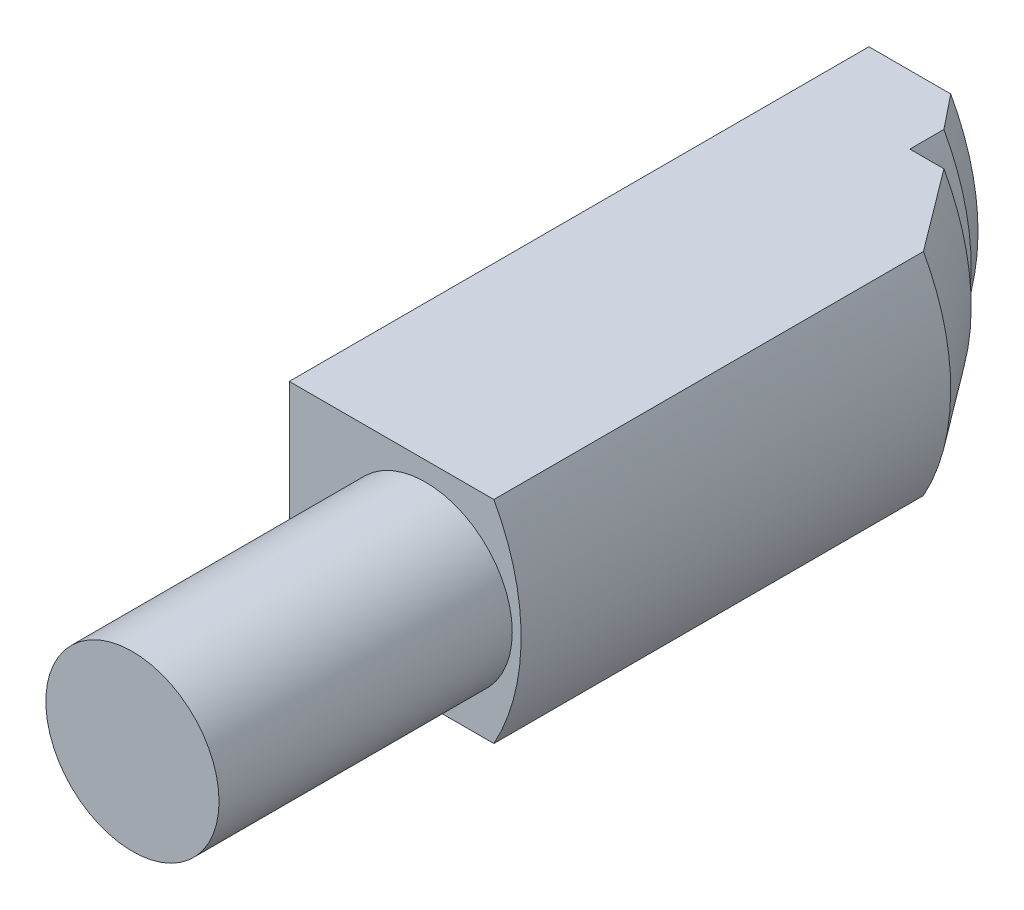
ISO-10303-21;
HEADER;
FILE_DESCRIPTION(('STEP AP214'),'2;1');
FILE_NAME('part.step','',(''),(''),'','','');
FILE_SCHEMA(('AUTOMOTIVE_DESIGN { 1 0 10303 214 1 1 1 1 }'));
ENDSEC;
DATA;
#1=APPLICATION_CONTEXT('core data for automotive mechanical design processes');
#2=APPLICATION_PROTOCOL_DEFINITION('international standard','automotive_design',2000,#1);
#3=PRODUCT_CONTEXT('',#1,'mechanical');
#4=PRODUCT('Part','Part','',(#3));
#5=PRODUCT_RELATED_PRODUCT_CATEGORY('part','',(#4));
#6=PRODUCT_DEFINITION_FORMATION('','',#4);
#7=PRODUCT_DEFINITION_CONTEXT('part definition',#1,'design');
#8=PRODUCT_DEFINITION('design','',#6,#7);
#9=PRODUCT_DEFINITION_SHAPE('','',#8);
#10=(LENGTH_UNIT() NAMED_UNIT(*) SI_UNIT(.MILLI.,.METRE.));
#11=(NAMED_UNIT(*) PLANE_ANGLE_UNIT() SI_UNIT($,.RADIAN.));
#12=(NAMED_UNIT(*) SI_UNIT($,.STERADIAN.) SOLID_ANGLE_UNIT());
#13=UNCERTAINTY_MEASURE_WITH_UNIT(LENGTH_MEASURE(1.E-05),#10,'distance_accuracy_value','');
#14=(GEOMETRIC_REPRESENTATION_CONTEXT(3) GLOBAL_UNCERTAINTY_ASSIGNED_CONTEXT((#13)) GLOBAL_UNIT_ASSIGNED_CONTEXT((#10,
#11,#12)) REPRESENTATION_CONTEXT('',''));
#15=CARTESIAN_POINT('',(0.,0.,0.));
#16=DIRECTION('',(0.,0.,1.));
#17=DIRECTION('',(1.,0.,0.));
#18=AXIS2_PLACEMENT_3D('',#15,#16,#17);
#19=CARTESIAN_POINT('',(-75.,-77.5,425.));
#20=DIRECTION('',(0.,1.,0.));
#21=DIRECTION('',(0.,0.,1.));
#22=AXIS2_PLACEMENT_3D('',#19,#20,#21);
#23=PLANE('',#22);
#24=DIRECTION('',(-0.62469504755442,0.,-0.780868809443034));
#25=VECTOR('',#24,1.);
#26=CARTESIAN_POINT('',(4.99999999999996,-77.5,24.9999999999999));
#27=LINE('',#26,#25);
#28=CARTESIAN_POINT('',(4.99999999999996,-77.5,24.9999999999999));
#29=VERTEX_POINT('',#28);
#30=CARTESIAN_POINT('',(-15.,-77.5,-3.20056481317721E-13));
#31=VERTEX_POINT('',#30);
#32=EDGE_CURVE('E206',#29,#31,#27,.T.);
#33=ORIENTED_EDGE('',*,*,#32,.F.);
#34=DIRECTION('',(0.,0.,-1.));
#35=VECTOR('',#34,1.);
#36=CARTESIAN_POINT('',(4.9999999999999,-77.5,49.9999999999999));
#37=LINE('',#36,#35);
#38=CARTESIAN_POINT('',(4.9999999999999,-77.5,49.9999999999999));
#39=VERTEX_POINT('',#38);
#40=EDGE_CURVE('E122',#39,#29,#37,.T.);
#41=ORIENTED_EDGE('',*,*,#40,.F.);
#42=DIRECTION('',(-1.,0.,0.));
#43=VECTOR('',#42,1.);
#44=CARTESIAN_POINT('',(4.9999999999999,-77.5,49.9999999999999));
#45=LINE('',#44,#43);
#46=CARTESIAN_POINT('',(29.9999999999999,-77.5,49.9999999999999));
#47=VERTEX_POINT('',#46);
#48=EDGE_CURVE('E207',#47,#39,#45,.T.);
#49=ORIENTED_EDGE('',*,*,#48,.F.);
#50=DIRECTION('',(-0.599999999999999,0.,-0.800000000000001));
#51=VECTOR('',#50,1.);
#52=CARTESIAN_POINT('',(29.9999999999999,-77.5,49.9999999999999));
#53=LINE('',#52,#51);
#54=CARTESIAN_POINT('',(74.9999999999998,-77.5,110.));
#55=VERTEX_POINT('',#54);
#56=EDGE_CURVE('E195',#55,#47,#53,.T.);
#57=ORIENTED_EDGE('',*,*,#56,.F.);
#58=DIRECTION('',(0.,0.,-1.));
#59=VECTOR('',#58,1.);
#60=CARTESIAN_POINT('',(75.0000000000001,-77.5,425.));
#61=LINE('',#60,#59);
#62=CARTESIAN_POINT('',(75.0000000000001,-77.5,425.));
#63=VERTEX_POINT('',#62);
#64=EDGE_CURVE('E308',#63,#55,#61,.T.);
#65=ORIENTED_EDGE('',*,*,#64,.F.);
#66=DIRECTION('',(1.,0.,0.));
#67=VECTOR('',#66,1.);
#68=CARTESIAN_POINT('',(-75.,-77.5,425.));
#69=LINE('',#68,#67);
#70=CARTESIAN_POINT('',(-75.,-77.5,425.));
#71=VERTEX_POINT('',#70);
#72=EDGE_CURVE('E169',#71,#63,#69,.T.);
#73=ORIENTED_EDGE('',*,*,#72,.F.);
#74=DIRECTION('',(0.,0.,-1.));
#75=VECTOR('',#74,1.);
#76=CARTESIAN_POINT('',(-75.,-77.5,425.));
#77=LINE('',#76,#75);
#78=CARTESIAN_POINT('',(-75.,-77.5,0.));
#79=VERTEX_POINT('',#78);
#80=EDGE_CURVE('E128',#71,#79,#77,.T.);
#81=ORIENTED_EDGE('',*,*,#80,.T.);
#82=DIRECTION('',(1.,0.,0.));
#83=VECTOR('',#82,1.);
#84=CARTESIAN_POINT('',(-75.,-77.5,0.));
#85=LINE('',#84,#83);
#86=EDGE_CURVE('E299',#79,#31,#85,.T.);
#87=ORIENTED_EDGE('',*,*,#86,.T.);
#88=EDGE_LOOP('',(#33,#41,#49,#57,#65,#73,#81,#87));
#89=FACE_BOUND('',#88,.T.);
#90=ADVANCED_FACE('F118',(#89),#23,.F.);
#91=CARTESIAN_POINT('',(-75.,77.5,425.));
#92=DIRECTION('',(0.,-1.,0.));
#93=DIRECTION('',(0.,0.,-1.));
#94=AXIS2_PLACEMENT_3D('',#91,#92,#93);
#95=PLANE('',#94);
#96=DIRECTION('',(-0.599999999999996,0.,-0.800000000000003));
#97=VECTOR('',#96,1.);
#98=CARTESIAN_POINT('',(29.9999999999998,77.5,49.9999999999998));
#99=LINE('',#98,#97);
#100=CARTESIAN_POINT('',(75.,77.5,110.));
#101=VERTEX_POINT('',#100);
#102=CARTESIAN_POINT('',(29.9999999999998,77.5,49.9999999999998));
#103=VERTEX_POINT('',#102);
#104=EDGE_CURVE('E136',#101,#103,#99,.T.);
#105=ORIENTED_EDGE('',*,*,#104,.T.);
#106=DIRECTION('',(-1.,0.,0.));
#107=VECTOR('',#106,1.);
#108=CARTESIAN_POINT('',(4.99999999999975,77.5,49.9999999999997));
#109=LINE('',#108,#107);
#110=CARTESIAN_POINT('',(4.99999999999975,77.5,49.9999999999997));
#111=VERTEX_POINT('',#110);
#112=EDGE_CURVE('E217',#103,#111,#109,.T.);
#113=ORIENTED_EDGE('',*,*,#112,.T.);
#114=DIRECTION('',(0.,0.,-1.));
#115=VECTOR('',#114,1.);
#116=CARTESIAN_POINT('',(4.99999999999975,77.5,49.9999999999997));
#117=LINE('',#116,#115);
#118=CARTESIAN_POINT('',(4.99999999999987,77.5,24.9999999999997));
#119=VERTEX_POINT('',#118);
#120=EDGE_CURVE('E229',#111,#119,#117,.T.);
#121=ORIENTED_EDGE('',*,*,#120,.T.);
#122=DIRECTION('',(-0.624695047554418,0.,-0.780868809443035));
#123=VECTOR('',#122,1.);
#124=CARTESIAN_POINT('',(4.99999999999987,77.5,24.9999999999997));
#125=LINE('',#124,#123);
#126=CARTESIAN_POINT('',(-15.,77.5,-5.62050406216485E-13));
#127=VERTEX_POINT('',#126);
#128=EDGE_CURVE('E241',#119,#127,#125,.T.);
#129=ORIENTED_EDGE('',*,*,#128,.T.);
#130=DIRECTION('',(-1.,0.,0.));
#131=VECTOR('',#130,1.);
#132=CARTESIAN_POINT('',(-75.,77.5,0.));
#133=LINE('',#132,#131);
#134=CARTESIAN_POINT('',(-75.,77.5,0.));
#135=VERTEX_POINT('',#134);
#136=EDGE_CURVE('E161',#127,#135,#133,.T.);
#137=ORIENTED_EDGE('',*,*,#136,.T.);
#138=DIRECTION('',(0.,0.,-1.));
#139=VECTOR('',#138,1.);
#140=CARTESIAN_POINT('',(-75.,77.5,425.));
#141=LINE('',#140,#139);
#142=CARTESIAN_POINT('',(-75.,77.5,425.));
#143=VERTEX_POINT('',#142);
#144=EDGE_CURVE('E309',#143,#135,#141,.T.);
#145=ORIENTED_EDGE('',*,*,#144,.F.);
#146=DIRECTION('',(-1.,0.,0.));
#147=VECTOR('',#146,1.);
#148=CARTESIAN_POINT('',(-75.,77.5,425.));
#149=LINE('',#148,#147);
#150=CARTESIAN_POINT('',(75.,77.5,425.));
#151=VERTEX_POINT('',#150);
#152=EDGE_CURVE('E146',#151,#143,#149,.T.);
#153=ORIENTED_EDGE('',*,*,#152,.F.);
#154=DIRECTION('',(0.,0.,-1.));
#155=VECTOR('',#154,1.);
#156=CARTESIAN_POINT('',(75.,77.5,425.));
#157=LINE('',#156,#155);
#158=EDGE_CURVE('E252',#151,#101,#157,.T.);
#159=ORIENTED_EDGE('',*,*,#158,.T.);
#160=EDGE_LOOP('',(#105,#113,#121,#129,#137,#145,#153,#159));
#161=FACE_BOUND('',#160,.T.);
#162=ADVANCED_FACE('F249',(#161),#95,.F.);
#163=CARTESIAN_POINT('',(-75.,77.5,425.));
#164=DIRECTION('',(1.,0.,0.));
#165=DIRECTION('',(0.,1.,0.));
#166=AXIS2_PLACEMENT_3D('',#163,#164,#165);
#167=PLANE('',#166);
#168=DIRECTION('',(0.,-1.,0.));
#169=VECTOR('',#168,1.);
#170=CARTESIAN_POINT('',(-75.,77.5,0.));
#171=LINE('',#170,#169);
#172=EDGE_CURVE('E297',#135,#79,#171,.T.);
#173=ORIENTED_EDGE('',*,*,#172,.T.);
#174=ORIENTED_EDGE('',*,*,#80,.F.);
#175=DIRECTION('',(0.,-1.,0.));
#176=VECTOR('',#175,1.);
#177=CARTESIAN_POINT('',(-75.,77.5,425.));
#178=LINE('',#177,#176);
#179=EDGE_CURVE('E298',#143,#71,#178,.T.);
#180=ORIENTED_EDGE('',*,*,#179,.F.);
#181=ORIENTED_EDGE('',*,*,#144,.T.);
#182=EDGE_LOOP('',(#173,#174,#180,#181));
#183=FACE_BOUND('',#182,.T.);
#184=ADVANCED_FACE('F120',(#183),#167,.F.);
#185=CARTESIAN_POINT('',(-65.15625,0.,425.));
#186=DIRECTION('',(0.,0.,-1.));
#187=DIRECTION('',(-1.,0.,0.));
#188=AXIS2_PLACEMENT_3D('',#185,#186,#187);
#189=CYLINDRICAL_SURFACE('',#188,160.15625);
#190=ORIENTED_EDGE('',*,*,#64,.T.);
#191=CARTESIAN_POINT('',(74.9999999999998,-77.5,110.));
#192=CARTESIAN_POINT('',(101.663535191219,-29.2798567207182,110.));
#193=CARTESIAN_POINT('',(101.663535191219,29.2798567207181,110.));
#194=CARTESIAN_POINT('',(74.9999999999995,77.5,110.));
#195=B_SPLINE_CURVE_WITH_KNOTS('',3,(#191,#192,#193,#194),.UNSPECIFIED.,.F.,.F.,(4,4),(0.,1.),.UNSPECIFIED.);
#196=EDGE_CURVE('E201',#55,#101,#195,.T.);
#197=ORIENTED_EDGE('',*,*,#196,.T.);
#198=ORIENTED_EDGE('',*,*,#158,.F.);
#199=CARTESIAN_POINT('',(-65.15625,0.,425.));
#200=DIRECTION('',(0.,0.,1.));
#201=DIRECTION('',(-1.,0.,0.));
#202=AXIS2_PLACEMENT_3D('',#199,#200,#201);
#203=CIRCLE('',#202,160.15625);
#204=EDGE_CURVE('E319',#63,#151,#203,.T.);
#205=ORIENTED_EDGE('',*,*,#204,.F.);
#206=EDGE_LOOP('',(#190,#197,#198,#205));
#207=FACE_BOUND('',#206,.T.);
#208=ADVANCED_FACE('F273',(#207),#189,.T.);
#209=CARTESIAN_POINT('',(-65.15625,0.,425.));
#210=DIRECTION('',(0.,0.,-1.));
#211=DIRECTION('',(-1.,0.,0.));
#212=AXIS2_PLACEMENT_3D('',#209,#210,#211);
#213=PLANE('',#212);
#214=CARTESIAN_POINT('',(25.,0.,425.));
#215=DIRECTION('',(0.,0.,1.));
#216=DIRECTION('',(1.,0.,0.));
#217=AXIS2_PLACEMENT_3D('',#214,#215,#216);
#218=CIRCLE('',#217,63.5);
#219=CARTESIAN_POINT('',(88.5,0.,425.));
#220=VERTEX_POINT('',#219);
#221=EDGE_CURVE('E13',#220,#220,#218,.T.);
#222=ORIENTED_EDGE('',*,*,#221,.F.);
#223=EDGE_LOOP('',(#222));
#224=FACE_BOUND('',#223,.T.);
#225=ORIENTED_EDGE('',*,*,#179,.T.);
#226=ORIENTED_EDGE('',*,*,#72,.T.);
#227=ORIENTED_EDGE('',*,*,#204,.T.);
#228=ORIENTED_EDGE('',*,*,#152,.T.);
#229=EDGE_LOOP('',(#225,#226,#227,#228));
#230=FACE_BOUND('',#229,.T.);
#231=ADVANCED_FACE('F477',(#224,#230),#213,.F.);
#232=CARTESIAN_POINT('',(-65.15625,0.,0.));
#233=DIRECTION('',(0.,0.,-1.));
#234=DIRECTION('',(-1.,0.,0.));
#235=AXIS2_PLACEMENT_3D('',#232,#233,#234);
#236=PLANE('',#235);
#237=CARTESIAN_POINT('',(-15.,-77.5,-3.12250225675825E-13));
#238=CARTESIAN_POINT('',(11.6635351912193,-29.2798567207182,-3.94938711364053E-13));
#239=CARTESIAN_POINT('',(11.6635351912193,29.2798567207181,-4.78494558790269E-13));
#240=CARTESIAN_POINT('',(-15.,77.5,-5.62050406216485E-13));
#241=B_SPLINE_CURVE_WITH_KNOTS('',3,(#237,#238,#239,#240),.UNSPECIFIED.,.F.,.F.,(4,4),(0.,1.),.UNSPECIFIED.);
#242=EDGE_CURVE('E294',#31,#127,#241,.T.);
#243=ORIENTED_EDGE('',*,*,#242,.F.);
#244=ORIENTED_EDGE('',*,*,#86,.F.);
#245=ORIENTED_EDGE('',*,*,#172,.F.);
#246=ORIENTED_EDGE('',*,*,#136,.F.);
#247=EDGE_LOOP('',(#243,#244,#245,#246));
#248=FACE_BOUND('',#247,.T.);
#249=ADVANCED_FACE('F271',(#248),#236,.T.);
#250=CARTESIAN_POINT('',(29.9999999999999,-77.5,49.9999999999999));
#251=CARTESIAN_POINT('',(56.6635351912192,-29.2798567207182,49.9999999999999));
#252=CARTESIAN_POINT('',(56.6635351912191,29.2798567207181,49.9999999999999));
#253=CARTESIAN_POINT('',(29.9999999999998,77.5,49.9999999999998));
#254=CARTESIAN_POINT('',(33.7499999999999,-77.5,54.9999999999999));
#255=CARTESIAN_POINT('',(60.4135351912191,-29.2798567207182,54.9999999999999));
#256=CARTESIAN_POINT('',(60.4135351912191,29.2798567207181,54.9999999999999));
#257=CARTESIAN_POINT('',(33.7499999999997,77.5,54.9999999999998));
#258=CARTESIAN_POINT('',(41.2499999999999,-77.5000000000001,65.));
#259=CARTESIAN_POINT('',(67.9135351912192,-29.2798567207183,64.9999999999999));
#260=CARTESIAN_POINT('',(67.9135351912192,29.2798567207182,64.9999999999999));
#261=CARTESIAN_POINT('',(41.2499999999998,77.5000000000001,64.9999999999999));
#262=CARTESIAN_POINT('',(52.4999999999998,-77.4999999999999,79.9999999999999));
#263=CARTESIAN_POINT('',(79.163535191219,-29.2798567207182,79.9999999999999));
#264=CARTESIAN_POINT('',(79.163535191219,29.2798567207181,79.9999999999999));
#265=CARTESIAN_POINT('',(52.4999999999995,77.4999999999999,79.9999999999999));
#266=CARTESIAN_POINT('',(63.7499999999999,-77.5000000000001,94.9999999999999));
#267=CARTESIAN_POINT('',(90.4135351912191,-29.2798567207183,94.9999999999999));
#268=CARTESIAN_POINT('',(90.4135351912191,29.2798567207181,94.9999999999999));
#269=CARTESIAN_POINT('',(63.7499999999997,77.5,94.9999999999999));
#270=CARTESIAN_POINT('',(71.2499999999998,-77.5,105.));
#271=CARTESIAN_POINT('',(97.913535191219,-29.2798567207182,105.));
#272=CARTESIAN_POINT('',(97.9135351912189,29.2798567207181,105.));
#273=CARTESIAN_POINT('',(71.2499999999995,77.5,105.));
#274=CARTESIAN_POINT('',(74.9999999999998,-77.5,110.));
#275=CARTESIAN_POINT('',(101.663535191219,-29.2798567207182,110.));
#276=CARTESIAN_POINT('',(101.663535191219,29.2798567207181,110.));
#277=CARTESIAN_POINT('',(74.9999999999995,77.5,110.));
#278=B_SPLINE_SURFACE_WITH_KNOTS('',3,3,((#250,#251,#252,#253),(#254,#255,#256,#257),(#258,#259,
#260,#261),(#262,#263,#264,#265),(#266,#267,#268,#269),(#270,#271,#272,#273),(#274,#275,#276,
#277)),.UNSPECIFIED.,.F.,.F.,.F.,(4,1,1,1,4),(4,4),(0.481815391201008,0.534334101552257,
0.586852811903506,0.639371522254755,0.691890232606005),(0.,1.),.UNSPECIFIED.);
#279=CARTESIAN_POINT('',(29.9999999999999,-77.5,49.9999999999999));
#280=CARTESIAN_POINT('',(56.6635351912192,-29.2798567207182,49.9999999999999));
#281=CARTESIAN_POINT('',(56.6635351912191,29.2798567207181,49.9999999999999));
#282=CARTESIAN_POINT('',(29.9999999999998,77.5,49.9999999999998));
#283=B_SPLINE_CURVE_WITH_KNOTS('',3,(#279,#280,#281,#282),.UNSPECIFIED.,.F.,.F.,(4,4),(0.,1.),.UNSPECIFIED.);
#284=EDGE_CURVE('E199',#47,#103,#283,.T.);
#285=ORIENTED_EDGE('',*,*,#56,.T.);
#286=ORIENTED_EDGE('',*,*,#284,.T.);
#287=ORIENTED_EDGE('',*,*,#104,.F.);
#288=ORIENTED_EDGE('',*,*,#196,.F.);
#289=EDGE_LOOP('',(#285,#286,#287,#288));
#290=FACE_BOUND('',#289,.T.);
#291=ADVANCED_FACE('F198',(#290),#278,.F.);
#292=CARTESIAN_POINT('',(4.9999999999999,-77.5,49.9999999999999));
#293=DIRECTION('',(0.,0.,1.));
#294=DIRECTION('',(1.,0.,0.));
#295=AXIS2_PLACEMENT_3D('',#292,#293,#294);
#296=PLANE('',#295);
#297=ORIENTED_EDGE('',*,*,#48,.T.);
#298=CARTESIAN_POINT('',(4.9999999999999,-77.5,49.9999999999999));
#299=CARTESIAN_POINT('',(31.6635351912191,-29.2798567207182,49.9999999999998));
#300=CARTESIAN_POINT('',(31.6635351912191,29.2798567207181,49.9999999999997));
#301=CARTESIAN_POINT('',(4.99999999999975,77.5,49.9999999999997));
#302=B_SPLINE_CURVE_WITH_KNOTS('',3,(#298,#299,#300,#301),.UNSPECIFIED.,.F.,.F.,(4,4),(0.,1.),.UNSPECIFIED.);
#303=EDGE_CURVE('E218',#39,#111,#302,.T.);
#304=ORIENTED_EDGE('',*,*,#303,.T.);
#305=ORIENTED_EDGE('',*,*,#112,.F.);
#306=ORIENTED_EDGE('',*,*,#284,.F.);
#307=EDGE_LOOP('',(#297,#304,#305,#306));
#308=FACE_BOUND('',#307,.T.);
#309=ADVANCED_FACE('F213',(#308),#296,.F.);
#310=CARTESIAN_POINT('',(4.99999999999996,-77.5,24.9999999999999));
#311=CARTESIAN_POINT('',(31.6635351912192,-29.2798567207182,24.9999999999998));
#312=CARTESIAN_POINT('',(31.6635351912192,29.2798567207181,24.9999999999997));
#313=CARTESIAN_POINT('',(4.99999999999987,77.5,24.9999999999997));
#314=CARTESIAN_POINT('',(4.99999999999995,-77.5,27.0833333333332));
#315=CARTESIAN_POINT('',(31.6635351912192,-29.2798567207182,27.0833333333331));
#316=CARTESIAN_POINT('',(31.6635351912192,29.2798567207181,27.0833333333331));
#317=CARTESIAN_POINT('',(4.99999999999986,77.5,27.083333333333));
#318=CARTESIAN_POINT('',(4.99999999999995,-77.5000000000001,31.2499999999999));
#319=CARTESIAN_POINT('',(31.6635351912192,-29.2798567207182,31.2499999999998));
#320=CARTESIAN_POINT('',(31.6635351912192,29.2798567207182,31.2499999999998));
#321=CARTESIAN_POINT('',(4.99999999999985,77.5000000000001,31.2499999999997));
#322=CARTESIAN_POINT('',(4.99999999999993,-77.4999999999999,37.4999999999999));
#323=CARTESIAN_POINT('',(31.6635351912192,-29.2798567207182,37.4999999999998));
#324=CARTESIAN_POINT('',(31.6635351912192,29.2798567207181,37.4999999999997));
#325=CARTESIAN_POINT('',(4.9999999999998,77.4999999999999,37.4999999999996));
#326=CARTESIAN_POINT('',(4.99999999999991,-77.5000000000001,43.7499999999999));
#327=CARTESIAN_POINT('',(31.6635351912192,-29.2798567207183,43.7499999999998));
#328=CARTESIAN_POINT('',(31.6635351912192,29.2798567207182,43.7499999999998));
#329=CARTESIAN_POINT('',(4.99999999999979,77.5000000000001,43.7499999999997));
#330=CARTESIAN_POINT('',(4.99999999999991,-77.5,47.9166666666665));
#331=CARTESIAN_POINT('',(31.6635351912192,-29.2798567207182,47.9166666666665));
#332=CARTESIAN_POINT('',(31.6635351912191,29.2798567207181,47.9166666666664));
#333=CARTESIAN_POINT('',(4.99999999999976,77.5,47.9166666666663));
#334=CARTESIAN_POINT('',(4.9999999999999,-77.5,49.9999999999999));
#335=CARTESIAN_POINT('',(31.6635351912191,-29.2798567207182,49.9999999999998));
#336=CARTESIAN_POINT('',(31.6635351912191,29.2798567207181,49.9999999999997));
#337=CARTESIAN_POINT('',(4.99999999999975,77.5,49.9999999999997));
#338=B_SPLINE_SURFACE_WITH_KNOTS('',3,3,((#310,#311,#312,#313),(#314,#315,#316,#317),(#318,#319,
#320,#321),(#322,#323,#324,#325),(#326,#327,#328,#329),(#330,#331,#332,#333),(#334,#335,#336,
#337)),.UNSPECIFIED.,.F.,.F.,.F.,(4,1,1,1,4),(4,4),(0.34176549693101,0.35927173371476,
0.376777970498509,0.394284207282259,0.411790444066009),(0.,1.),.UNSPECIFIED.);
#339=CARTESIAN_POINT('',(4.99999999999996,-77.5,24.9999999999999));
#340=CARTESIAN_POINT('',(31.6635351912192,-29.2798567207182,24.9999999999998));
#341=CARTESIAN_POINT('',(31.6635351912192,29.2798567207181,24.9999999999997));
#342=CARTESIAN_POINT('',(4.99999999999987,77.5,24.9999999999997));
#343=B_SPLINE_CURVE_WITH_KNOTS('',3,(#339,#340,#341,#342),.UNSPECIFIED.,.F.,.F.,(4,4),(0.,1.),.UNSPECIFIED.);
#344=EDGE_CURVE('E402',#29,#119,#343,.T.);
#345=ORIENTED_EDGE('',*,*,#40,.T.);
#346=ORIENTED_EDGE('',*,*,#344,.T.);
#347=ORIENTED_EDGE('',*,*,#120,.F.);
#348=ORIENTED_EDGE('',*,*,#303,.F.);
#349=EDGE_LOOP('',(#345,#346,#347,#348));
#350=FACE_BOUND('',#349,.T.);
#351=ADVANCED_FACE('F336',(#350),#338,.F.);
#352=CARTESIAN_POINT('',(-15.,-77.5,-3.12250225675825E-13));
#353=CARTESIAN_POINT('',(11.6635351912193,-29.2798567207182,-3.94938711364053E-13));
#354=CARTESIAN_POINT('',(11.6635351912193,29.2798567207181,-4.78494558790269E-13));
#355=CARTESIAN_POINT('',(-15.,77.5,-5.62050406216485E-13));
#356=CARTESIAN_POINT('',(-13.3333333333333,-77.5,2.08333333333304));
#357=CARTESIAN_POINT('',(13.330201857886,-29.2798567207182,2.08333333333296));
#358=CARTESIAN_POINT('',(13.330201857886,29.2798567207181,2.08333333333288));
#359=CARTESIAN_POINT('',(-13.3333333333333,77.5,2.08333333333279));
#360=CARTESIAN_POINT('',(-10.,-77.5,6.24999999999974));
#361=CARTESIAN_POINT('',(16.6635351912193,-29.2798567207182,6.24999999999966));
#362=CARTESIAN_POINT('',(16.6635351912193,29.2798567207181,6.24999999999958));
#363=CARTESIAN_POINT('',(-10.,77.4999999999999,6.2499999999995));
#364=CARTESIAN_POINT('',(-5.,-77.5000000000001,12.4999999999998));
#365=CARTESIAN_POINT('',(21.6635351912193,-29.2798567207182,12.4999999999997));
#366=CARTESIAN_POINT('',(21.6635351912193,29.2798567207182,12.4999999999996));
#367=CARTESIAN_POINT('',(-5.00000000000006,77.5000000000002,12.4999999999996));
#368=CARTESIAN_POINT('',(0.,-77.4999999999999,18.7499999999998));
#369=CARTESIAN_POINT('',(26.6635351912192,-29.2798567207182,18.7499999999998));
#370=CARTESIAN_POINT('',(26.6635351912192,29.2798567207181,18.7499999999997));
#371=CARTESIAN_POINT('',(0.,77.4999999999999,18.7499999999996));
#372=CARTESIAN_POINT('',(3.33333333333329,-77.5,22.9166666666665));
#373=CARTESIAN_POINT('',(29.9968685245526,-29.2798567207182,22.9166666666665));
#374=CARTESIAN_POINT('',(29.9968685245526,29.2798567207181,22.9166666666664));
#375=CARTESIAN_POINT('',(3.33333333333321,77.5,22.9166666666663));
#376=CARTESIAN_POINT('',(4.99999999999996,-77.5,24.9999999999999));
#377=CARTESIAN_POINT('',(31.6635351912192,-29.2798567207182,24.9999999999998));
#378=CARTESIAN_POINT('',(31.6635351912192,29.2798567207181,24.9999999999997));
#379=CARTESIAN_POINT('',(4.99999999999987,77.5,24.9999999999997));
#380=B_SPLINE_SURFACE_WITH_KNOTS('',3,3,((#352,#353,#354,#355),(#356,#357,#358,#359),(#360,#361,
#362,#363),(#364,#365,#366,#367),(#368,#369,#370,#371),(#372,#373,#374,#375),(#376,#377,#378,
#379)),.UNSPECIFIED.,.F.,.F.,.F.,(4,1,1,1,4),(4,4),(0.252089809685996,0.27450873149725,
0.296927653308503,0.319346575119756,0.34176549693101),(0.,1.),.UNSPECIFIED.);
#381=ORIENTED_EDGE('',*,*,#32,.T.);
#382=ORIENTED_EDGE('',*,*,#242,.T.);
#383=ORIENTED_EDGE('',*,*,#128,.F.);
#384=ORIENTED_EDGE('',*,*,#344,.F.);
#385=EDGE_LOOP('',(#381,#382,#383,#384));
#386=FACE_BOUND('',#385,.T.);
#387=ADVANCED_FACE('F364',(#386),#380,.F.);
#388=CARTESIAN_POINT('',(25.,0.,640.));
#389=DIRECTION('',(0.,0.,-1.));
#390=DIRECTION('',(-1.,0.,0.));
#391=AXIS2_PLACEMENT_3D('',#388,#389,#390);
#392=CYLINDRICAL_SURFACE('',#391,63.5);
#393=CARTESIAN_POINT('',(25.,0.,640.));
#394=DIRECTION('',(0.,0.,1.));
#395=DIRECTION('',(1.,0.,0.));
#396=AXIS2_PLACEMENT_3D('',#393,#394,#395);
#397=CIRCLE('',#396,63.5);
#398=CARTESIAN_POINT('',(88.5,0.,640.));
#399=VERTEX_POINT('',#398);
#400=EDGE_CURVE('E222',#399,#399,#397,.T.);
#401=ORIENTED_EDGE('',*,*,#400,.F.);
#402=EDGE_LOOP('',(#401));
#403=FACE_BOUND('',#402,.T.);
#404=ORIENTED_EDGE('',*,*,#221,.T.);
#405=EDGE_LOOP('',(#404));
#406=FACE_BOUND('',#405,.T.);
#407=ADVANCED_FACE('F375',(#403,#406),#392,.T.);
#408=CARTESIAN_POINT('',(25.,0.,640.));
#409=DIRECTION('',(0.,0.,1.));
#410=DIRECTION('',(1.,0.,0.));
#411=AXIS2_PLACEMENT_3D('',#408,#409,#410);
#412=PLANE('',#411);
#413=ORIENTED_EDGE('',*,*,#400,.T.);
#414=EDGE_LOOP('',(#413));
#415=FACE_BOUND('',#414,.T.);
#416=ADVANCED_FACE('F513',(#415),#412,.T.);
#417=CLOSED_SHELL('',(#90,#162,#184,#208,#231,#249,#291,#309,#351,#387,#407,#416));
#418=MANIFOLD_SOLID_BREP('B2',#417);
#419=ADVANCED_BREP_SHAPE_REPRESENTATION('',(#18,#418),#14);
#420=SHAPE_DEFINITION_REPRESENTATION(#9,#419);
ENDSEC;
END-ISO-10303-21;
